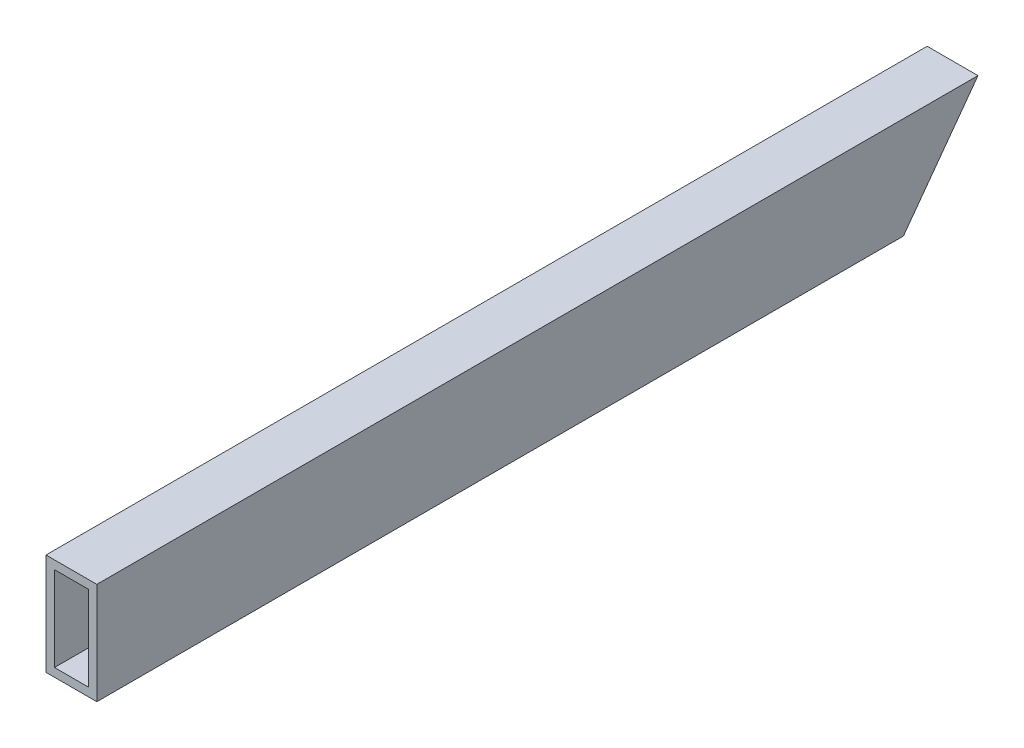
ISO-10303-21;
HEADER;
FILE_DESCRIPTION(('STEP AP214'),'2;1');
FILE_NAME('part.step','',(''),(''),'','','');
FILE_SCHEMA(('AUTOMOTIVE_DESIGN { 1 0 10303 214 1 1 1 1 }'));
ENDSEC;
DATA;
#1=APPLICATION_CONTEXT('core data for automotive mechanical design processes');
#2=APPLICATION_PROTOCOL_DEFINITION('international standard','automotive_design',2000,#1);
#3=PRODUCT_CONTEXT('',#1,'mechanical');
#4=PRODUCT('Part','Part','',(#3));
#5=PRODUCT_RELATED_PRODUCT_CATEGORY('part','',(#4));
#6=PRODUCT_DEFINITION_FORMATION('','',#4);
#7=PRODUCT_DEFINITION_CONTEXT('part definition',#1,'design');
#8=PRODUCT_DEFINITION('design','',#6,#7);
#9=PRODUCT_DEFINITION_SHAPE('','',#8);
#10=(LENGTH_UNIT() NAMED_UNIT(*) SI_UNIT(.MILLI.,.METRE.));
#11=(NAMED_UNIT(*) PLANE_ANGLE_UNIT() SI_UNIT($,.RADIAN.));
#12=(NAMED_UNIT(*) SI_UNIT($,.STERADIAN.) SOLID_ANGLE_UNIT());
#13=UNCERTAINTY_MEASURE_WITH_UNIT(LENGTH_MEASURE(1.E-05),#10,'distance_accuracy_value','');
#14=(GEOMETRIC_REPRESENTATION_CONTEXT(3) GLOBAL_UNCERTAINTY_ASSIGNED_CONTEXT((#13)) GLOBAL_UNIT_ASSIGNED_CONTEXT((#10,
#11,#12)) REPRESENTATION_CONTEXT('',''));
#15=CARTESIAN_POINT('',(0.,0.,0.));
#16=DIRECTION('',(0.,0.,1.));
#17=DIRECTION('',(1.,0.,0.));
#18=AXIS2_PLACEMENT_3D('',#15,#16,#17);
#19=CARTESIAN_POINT('',(0.,0.,330.2));
#20=DIRECTION('',(0.,0.,-1.));
#21=DIRECTION('',(-1.,0.,0.));
#22=AXIS2_PLACEMENT_3D('',#19,#20,#21);
#23=PLANE('',#22);
#24=DIRECTION('',(0.,1.,0.));
#25=VECTOR('',#24,1.);
#26=CARTESIAN_POINT('',(9.525,-19.05,330.2));
#27=LINE('',#26,#25);
#28=CARTESIAN_POINT('',(9.525,-19.05,330.2));
#29=VERTEX_POINT('',#28);
#30=CARTESIAN_POINT('',(9.525,19.05,330.2));
#31=VERTEX_POINT('',#30);
#32=EDGE_CURVE('E111',#29,#31,#27,.T.);
#33=ORIENTED_EDGE('',*,*,#32,.T.);
#34=DIRECTION('',(-1.,0.,0.));
#35=VECTOR('',#34,1.);
#36=CARTESIAN_POINT('',(-9.525,19.05,330.2));
#37=LINE('',#36,#35);
#38=CARTESIAN_POINT('',(-9.525,19.05,330.2));
#39=VERTEX_POINT('',#38);
#40=EDGE_CURVE('E126',#31,#39,#37,.T.);
#41=ORIENTED_EDGE('',*,*,#40,.T.);
#42=DIRECTION('',(0.,-1.,0.));
#43=VECTOR('',#42,1.);
#44=CARTESIAN_POINT('',(-9.525,-19.05,330.2));
#45=LINE('',#44,#43);
#46=CARTESIAN_POINT('',(-9.525,-19.05,330.2));
#47=VERTEX_POINT('',#46);
#48=EDGE_CURVE('E115',#39,#47,#45,.T.);
#49=ORIENTED_EDGE('',*,*,#48,.T.);
#50=DIRECTION('',(1.,0.,0.));
#51=VECTOR('',#50,1.);
#52=CARTESIAN_POINT('',(-9.525,-19.05,330.2));
#53=LINE('',#52,#51);
#54=EDGE_CURVE('E122',#47,#29,#53,.T.);
#55=ORIENTED_EDGE('',*,*,#54,.T.);
#56=EDGE_LOOP('',(#33,#41,#49,#55));
#57=FACE_BOUND('',#56,.T.);
#58=DIRECTION('',(1.,0.,0.));
#59=VECTOR('',#58,1.);
#60=CARTESIAN_POINT('',(-6.35,-15.875,330.2));
#61=LINE('',#60,#59);
#62=CARTESIAN_POINT('',(-6.35,-15.875,330.2));
#63=VERTEX_POINT('',#62);
#64=CARTESIAN_POINT('',(6.35,-15.875,330.2));
#65=VERTEX_POINT('',#64);
#66=EDGE_CURVE('E148',#63,#65,#61,.T.);
#67=ORIENTED_EDGE('',*,*,#66,.F.);
#68=DIRECTION('',(0.,-1.,0.));
#69=VECTOR('',#68,1.);
#70=CARTESIAN_POINT('',(-6.35,-15.875,330.2));
#71=LINE('',#70,#69);
#72=CARTESIAN_POINT('',(-6.35,15.875,330.2));
#73=VERTEX_POINT('',#72);
#74=EDGE_CURVE('E141',#73,#63,#71,.T.);
#75=ORIENTED_EDGE('',*,*,#74,.F.);
#76=DIRECTION('',(-1.,0.,0.));
#77=VECTOR('',#76,1.);
#78=CARTESIAN_POINT('',(-6.35,15.875,330.2));
#79=LINE('',#78,#77);
#80=CARTESIAN_POINT('',(6.35,15.875,330.2));
#81=VERTEX_POINT('',#80);
#82=EDGE_CURVE('E143',#81,#73,#79,.T.);
#83=ORIENTED_EDGE('',*,*,#82,.F.);
#84=DIRECTION('',(0.,1.,0.));
#85=VECTOR('',#84,1.);
#86=CARTESIAN_POINT('',(6.35,-15.875,330.2));
#87=LINE('',#86,#85);
#88=EDGE_CURVE('E146',#65,#81,#87,.T.);
#89=ORIENTED_EDGE('',*,*,#88,.F.);
#90=EDGE_LOOP('',(#67,#75,#83,#89));
#91=FACE_BOUND('',#90,.T.);
#92=ADVANCED_FACE('F32',(#57,#91),#23,.F.);
#93=CARTESIAN_POINT('',(9.525,-19.05,330.2));
#94=DIRECTION('',(-1.,0.,0.));
#95=DIRECTION('',(0.,-1.,0.));
#96=AXIS2_PLACEMENT_3D('',#93,#94,#95);
#97=PLANE('',#96);
#98=DIRECTION('',(0.,0.,-1.));
#99=VECTOR('',#98,1.);
#100=CARTESIAN_POINT('',(9.525,-19.05,330.2));
#101=LINE('',#100,#99);
#102=CARTESIAN_POINT('',(9.525,-19.05,27.94));
#103=VERTEX_POINT('',#102);
#104=EDGE_CURVE('E118',#29,#103,#101,.T.);
#105=ORIENTED_EDGE('',*,*,#104,.T.);
#106=DIRECTION('',(0.,-0.806404995855706,0.591363663627517));
#107=VECTOR('',#106,1.);
#108=CARTESIAN_POINT('',(9.525,19.05,0.));
#109=LINE('',#108,#107);
#110=CARTESIAN_POINT('',(9.525,19.05,0.));
#111=VERTEX_POINT('',#110);
#112=EDGE_CURVE('E47',#111,#103,#109,.T.);
#113=ORIENTED_EDGE('',*,*,#112,.F.);
#114=DIRECTION('',(0.,0.,-1.));
#115=VECTOR('',#114,1.);
#116=CARTESIAN_POINT('',(9.525,19.05,330.2));
#117=LINE('',#116,#115);
#118=EDGE_CURVE('E40',#31,#111,#117,.T.);
#119=ORIENTED_EDGE('',*,*,#118,.F.);
#120=ORIENTED_EDGE('',*,*,#32,.F.);
#121=EDGE_LOOP('',(#105,#113,#119,#120));
#122=FACE_BOUND('',#121,.T.);
#123=ADVANCED_FACE('F34',(#122),#97,.F.);
#124=CARTESIAN_POINT('',(-9.525,19.05,330.2));
#125=DIRECTION('',(0.,-1.,0.));
#126=DIRECTION('',(0.,0.,-1.));
#127=AXIS2_PLACEMENT_3D('',#124,#125,#126);
#128=PLANE('',#127);
#129=DIRECTION('',(-1.,0.,0.));
#130=VECTOR('',#129,1.);
#131=CARTESIAN_POINT('',(-9.525,19.05,0.));
#132=LINE('',#131,#130);
#133=CARTESIAN_POINT('',(-9.525,19.05,0.));
#134=VERTEX_POINT('',#133);
#135=EDGE_CURVE('E97',#111,#134,#132,.T.);
#136=ORIENTED_EDGE('',*,*,#135,.T.);
#137=DIRECTION('',(0.,0.,-1.));
#138=VECTOR('',#137,1.);
#139=CARTESIAN_POINT('',(-9.525,19.05,330.2));
#140=LINE('',#139,#138);
#141=EDGE_CURVE('E108',#39,#134,#140,.T.);
#142=ORIENTED_EDGE('',*,*,#141,.F.);
#143=ORIENTED_EDGE('',*,*,#40,.F.);
#144=ORIENTED_EDGE('',*,*,#118,.T.);
#145=EDGE_LOOP('',(#136,#142,#143,#144));
#146=FACE_BOUND('',#145,.T.);
#147=ADVANCED_FACE('F107',(#146),#128,.F.);
#148=CARTESIAN_POINT('',(-9.525,-19.05,330.2));
#149=DIRECTION('',(1.,0.,0.));
#150=DIRECTION('',(0.,1.,0.));
#151=AXIS2_PLACEMENT_3D('',#148,#149,#150);
#152=PLANE('',#151);
#153=ORIENTED_EDGE('',*,*,#141,.T.);
#154=DIRECTION('',(0.,-0.806404995855706,0.591363663627517));
#155=VECTOR('',#154,1.);
#156=CARTESIAN_POINT('',(-9.525,19.05,0.));
#157=LINE('',#156,#155);
#158=CARTESIAN_POINT('',(-9.525,-19.05,27.94));
#159=VERTEX_POINT('',#158);
#160=EDGE_CURVE('E94',#134,#159,#157,.T.);
#161=ORIENTED_EDGE('',*,*,#160,.T.);
#162=DIRECTION('',(0.,0.,-1.));
#163=VECTOR('',#162,1.);
#164=CARTESIAN_POINT('',(-9.525,-19.05,330.2));
#165=LINE('',#164,#163);
#166=EDGE_CURVE('E116',#47,#159,#165,.T.);
#167=ORIENTED_EDGE('',*,*,#166,.F.);
#168=ORIENTED_EDGE('',*,*,#48,.F.);
#169=EDGE_LOOP('',(#153,#161,#167,#168));
#170=FACE_BOUND('',#169,.T.);
#171=ADVANCED_FACE('F114',(#170),#152,.F.);
#172=CARTESIAN_POINT('',(-9.525,-19.05,330.2));
#173=DIRECTION('',(0.,1.,0.));
#174=DIRECTION('',(0.,0.,1.));
#175=AXIS2_PLACEMENT_3D('',#172,#173,#174);
#176=PLANE('',#175);
#177=ORIENTED_EDGE('',*,*,#166,.T.);
#178=DIRECTION('',(1.,0.,0.));
#179=VECTOR('',#178,1.);
#180=CARTESIAN_POINT('',(-9.525,-19.05,27.94));
#181=LINE('',#180,#179);
#182=EDGE_CURVE('E98',#159,#103,#181,.T.);
#183=ORIENTED_EDGE('',*,*,#182,.T.);
#184=ORIENTED_EDGE('',*,*,#104,.F.);
#185=ORIENTED_EDGE('',*,*,#54,.F.);
#186=EDGE_LOOP('',(#177,#183,#184,#185));
#187=FACE_BOUND('',#186,.T.);
#188=ADVANCED_FACE('F158',(#187),#176,.F.);
#189=CARTESIAN_POINT('',(-6.35,-15.875,330.2));
#190=DIRECTION('',(0.,1.,0.));
#191=DIRECTION('',(0.,0.,1.));
#192=AXIS2_PLACEMENT_3D('',#189,#190,#191);
#193=PLANE('',#192);
#194=DIRECTION('',(1.,0.,0.));
#195=VECTOR('',#194,1.);
#196=CARTESIAN_POINT('',(-6.35000000000001,-15.875,25.6116666666667));
#197=LINE('',#196,#195);
#198=CARTESIAN_POINT('',(-6.35,-15.875,25.6116666666666));
#199=VERTEX_POINT('',#198);
#200=CARTESIAN_POINT('',(6.35,-15.875,25.6116666666666));
#201=VERTEX_POINT('',#200);
#202=EDGE_CURVE('E150',#199,#201,#197,.T.);
#203=ORIENTED_EDGE('',*,*,#202,.F.);
#204=DIRECTION('',(0.,0.,-1.));
#205=VECTOR('',#204,1.);
#206=CARTESIAN_POINT('',(-6.35,-15.875,330.2));
#207=LINE('',#206,#205);
#208=EDGE_CURVE('E138',#63,#199,#207,.T.);
#209=ORIENTED_EDGE('',*,*,#208,.F.);
#210=ORIENTED_EDGE('',*,*,#66,.T.);
#211=DIRECTION('',(0.,0.,-1.));
#212=VECTOR('',#211,1.);
#213=CARTESIAN_POINT('',(6.35,-15.875,330.2));
#214=LINE('',#213,#212);
#215=EDGE_CURVE('E112',#65,#201,#214,.T.);
#216=ORIENTED_EDGE('',*,*,#215,.T.);
#217=EDGE_LOOP('',(#203,#209,#210,#216));
#218=FACE_BOUND('',#217,.T.);
#219=ADVANCED_FACE('F174',(#218),#193,.T.);
#220=CARTESIAN_POINT('',(6.35,-15.875,330.2));
#221=DIRECTION('',(-1.,0.,0.));
#222=DIRECTION('',(0.,-1.,0.));
#223=AXIS2_PLACEMENT_3D('',#220,#221,#222);
#224=PLANE('',#223);
#225=DIRECTION('',(0.,0.806404995855706,-0.591363663627517));
#226=VECTOR('',#225,1.);
#227=CARTESIAN_POINT('',(6.34999999999999,-161.126661849711,132.129552023121));
#228=LINE('',#227,#226);
#229=CARTESIAN_POINT('',(6.35,15.875,2.32833333333332));
#230=VERTEX_POINT('',#229);
#231=EDGE_CURVE('E152',#201,#230,#228,.T.);
#232=ORIENTED_EDGE('',*,*,#231,.F.);
#233=ORIENTED_EDGE('',*,*,#215,.F.);
#234=ORIENTED_EDGE('',*,*,#88,.T.);
#235=DIRECTION('',(0.,0.,-1.));
#236=VECTOR('',#235,1.);
#237=CARTESIAN_POINT('',(6.35,15.875,330.2));
#238=LINE('',#237,#236);
#239=EDGE_CURVE('E132',#81,#230,#238,.T.);
#240=ORIENTED_EDGE('',*,*,#239,.T.);
#241=EDGE_LOOP('',(#232,#233,#234,#240));
#242=FACE_BOUND('',#241,.T.);
#243=ADVANCED_FACE('F177',(#242),#224,.T.);
#244=CARTESIAN_POINT('',(-6.35,15.875,330.2));
#245=DIRECTION('',(0.,-1.,0.));
#246=DIRECTION('',(1.,0.,0.));
#247=AXIS2_PLACEMENT_3D('',#244,#245,#246);
#248=PLANE('',#247);
#249=DIRECTION('',(-1.,0.,0.));
#250=VECTOR('',#249,1.);
#251=CARTESIAN_POINT('',(-6.35000000000008,15.875,2.32833333333332));
#252=LINE('',#251,#250);
#253=CARTESIAN_POINT('',(-6.35,15.875,2.32833333333331));
#254=VERTEX_POINT('',#253);
#255=EDGE_CURVE('E54',#230,#254,#252,.T.);
#256=ORIENTED_EDGE('',*,*,#255,.F.);
#257=ORIENTED_EDGE('',*,*,#239,.F.);
#258=ORIENTED_EDGE('',*,*,#82,.T.);
#259=DIRECTION('',(0.,0.,-1.));
#260=VECTOR('',#259,1.);
#261=CARTESIAN_POINT('',(-6.35,15.875,330.2));
#262=LINE('',#261,#260);
#263=EDGE_CURVE('E135',#73,#254,#262,.T.);
#264=ORIENTED_EDGE('',*,*,#263,.T.);
#265=EDGE_LOOP('',(#256,#257,#258,#264));
#266=FACE_BOUND('',#265,.T.);
#267=ADVANCED_FACE('F180',(#266),#248,.T.);
#268=CARTESIAN_POINT('',(-6.35,-15.875,330.2));
#269=DIRECTION('',(1.,0.,0.));
#270=DIRECTION('',(0.,0.,-1.));
#271=AXIS2_PLACEMENT_3D('',#268,#269,#270);
#272=PLANE('',#271);
#273=DIRECTION('',(0.,-0.806404995855706,0.591363663627517));
#274=VECTOR('',#273,1.);
#275=CARTESIAN_POINT('',(-6.35,-161.126661849711,132.129552023121));
#276=LINE('',#275,#274);
#277=EDGE_CURVE('E11',#254,#199,#276,.T.);
#278=ORIENTED_EDGE('',*,*,#277,.F.);
#279=ORIENTED_EDGE('',*,*,#263,.F.);
#280=ORIENTED_EDGE('',*,*,#74,.T.);
#281=ORIENTED_EDGE('',*,*,#208,.T.);
#282=EDGE_LOOP('',(#278,#279,#280,#281));
#283=FACE_BOUND('',#282,.T.);
#284=ADVANCED_FACE('F182',(#283),#272,.T.);
#285=CARTESIAN_POINT('',(-9.525,19.05,0.));
#286=DIRECTION('',(0.,0.591363663627517,0.806404995855706));
#287=DIRECTION('',(0.,-0.806404995855706,0.591363663627517));
#288=AXIS2_PLACEMENT_3D('',#285,#286,#287);
#289=PLANE('',#288);
#290=ORIENTED_EDGE('',*,*,#202,.T.);
#291=ORIENTED_EDGE('',*,*,#231,.T.);
#292=ORIENTED_EDGE('',*,*,#255,.T.);
#293=ORIENTED_EDGE('',*,*,#277,.T.);
#294=EDGE_LOOP('',(#290,#291,#292,#293));
#295=FACE_BOUND('',#294,.T.);
#296=ORIENTED_EDGE('',*,*,#112,.T.);
#297=ORIENTED_EDGE('',*,*,#182,.F.);
#298=ORIENTED_EDGE('',*,*,#160,.F.);
#299=ORIENTED_EDGE('',*,*,#135,.F.);
#300=EDGE_LOOP('',(#296,#297,#298,#299));
#301=FACE_BOUND('',#300,.T.);
#302=ADVANCED_FACE('F96',(#295,#301),#289,.F.);
#303=CLOSED_SHELL('',(#92,#123,#147,#171,#188,#219,#243,#267,#284,#302));
#304=MANIFOLD_SOLID_BREP('B2',#303);
#305=ADVANCED_BREP_SHAPE_REPRESENTATION('',(#18,#304),#14);
#306=SHAPE_DEFINITION_REPRESENTATION(#9,#305);
ENDSEC;
END-ISO-10303-21;
